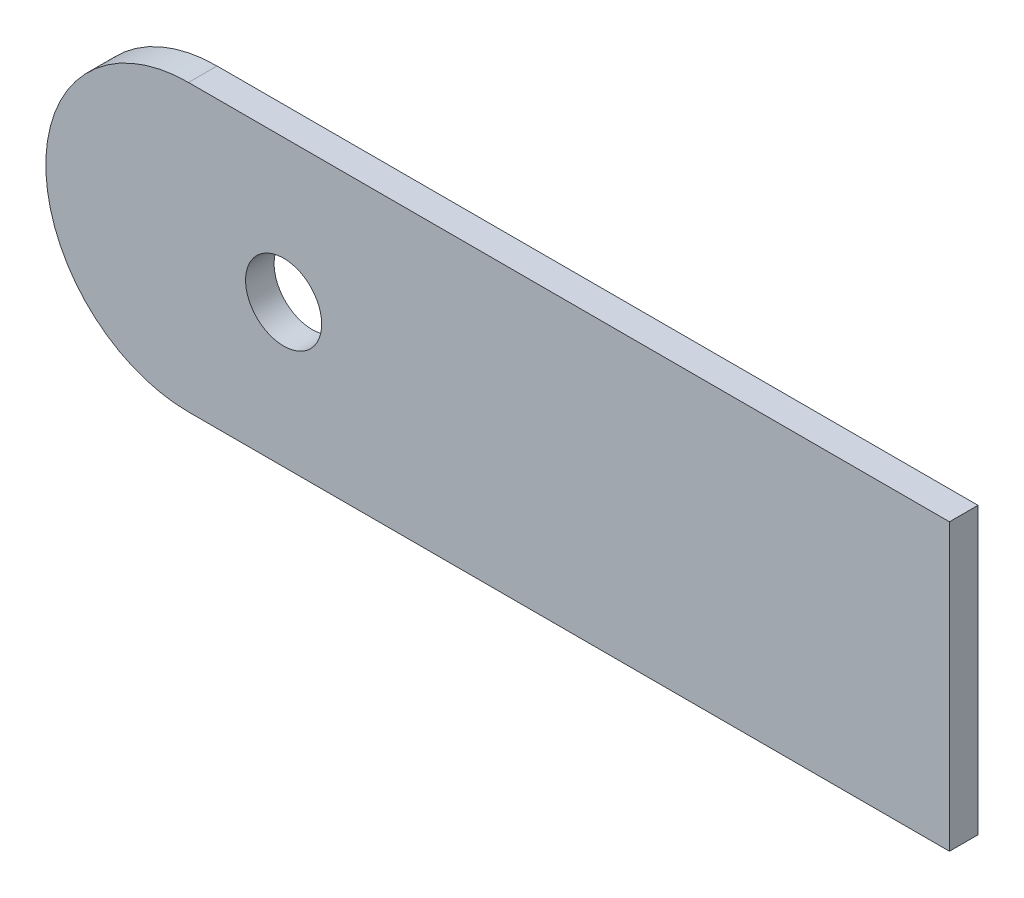
ISO-10303-21;
HEADER;
FILE_DESCRIPTION(('STEP AP214'),'2;1');
FILE_NAME('part.step','',(''),(''),'','','');
FILE_SCHEMA(('AUTOMOTIVE_DESIGN { 1 0 10303 214 1 1 1 1 }'));
ENDSEC;
DATA;
#1=APPLICATION_CONTEXT('core data for automotive mechanical design processes');
#2=APPLICATION_PROTOCOL_DEFINITION('international standard','automotive_design',2000,#1);
#3=PRODUCT_CONTEXT('',#1,'mechanical');
#4=PRODUCT('Part','Part','',(#3));
#5=PRODUCT_RELATED_PRODUCT_CATEGORY('part','',(#4));
#6=PRODUCT_DEFINITION_FORMATION('','',#4);
#7=PRODUCT_DEFINITION_CONTEXT('part definition',#1,'design');
#8=PRODUCT_DEFINITION('design','',#6,#7);
#9=PRODUCT_DEFINITION_SHAPE('','',#8);
#10=(LENGTH_UNIT() NAMED_UNIT(*) SI_UNIT(.MILLI.,.METRE.));
#11=(NAMED_UNIT(*) PLANE_ANGLE_UNIT() SI_UNIT($,.RADIAN.));
#12=(NAMED_UNIT(*) SI_UNIT($,.STERADIAN.) SOLID_ANGLE_UNIT());
#13=UNCERTAINTY_MEASURE_WITH_UNIT(LENGTH_MEASURE(1.E-05),#10,'distance_accuracy_value','');
#14=(GEOMETRIC_REPRESENTATION_CONTEXT(3) GLOBAL_UNCERTAINTY_ASSIGNED_CONTEXT((#13)) GLOBAL_UNIT_ASSIGNED_CONTEXT((#10,
#11,#12)) REPRESENTATION_CONTEXT('',''));
#15=CARTESIAN_POINT('',(0.,0.,0.));
#16=DIRECTION('',(0.,0.,1.));
#17=DIRECTION('',(1.,0.,0.));
#18=AXIS2_PLACEMENT_3D('',#15,#16,#17);
#19=CARTESIAN_POINT('',(-40.,0.,3.));
#20=DIRECTION('',(0.,0.,1.));
#21=DIRECTION('',(1.,0.,0.));
#22=AXIS2_PLACEMENT_3D('',#19,#20,#21);
#23=PLANE('',#22);
#24=DIRECTION('',(0.,1.,0.));
#25=VECTOR('',#24,1.);
#26=CARTESIAN_POINT('',(40.,15.,3.));
#27=LINE('',#26,#25);
#28=CARTESIAN_POINT('',(40.,-15.,3.));
#29=VERTEX_POINT('',#28);
#30=CARTESIAN_POINT('',(40.,15.,3.));
#31=VERTEX_POINT('',#30);
#32=EDGE_CURVE('E91',#29,#31,#27,.T.);
#33=ORIENTED_EDGE('',*,*,#32,.T.);
#34=DIRECTION('',(-1.,0.,0.));
#35=VECTOR('',#34,1.);
#36=CARTESIAN_POINT('',(-40.,15.,3.));
#37=LINE('',#36,#35);
#38=CARTESIAN_POINT('',(-40.,15.,3.));
#39=VERTEX_POINT('',#38);
#40=EDGE_CURVE('E86',#31,#39,#37,.T.);
#41=ORIENTED_EDGE('',*,*,#40,.T.);
#42=CARTESIAN_POINT('',(-40.,0.,3.));
#43=DIRECTION('',(0.,0.,1.));
#44=DIRECTION('',(1.,0.,0.));
#45=AXIS2_PLACEMENT_3D('',#42,#43,#44);
#46=CIRCLE('',#45,15.);
#47=CARTESIAN_POINT('',(-40.,-15.,3.));
#48=VERTEX_POINT('',#47);
#49=EDGE_CURVE('E89',#39,#48,#46,.T.);
#50=ORIENTED_EDGE('',*,*,#49,.T.);
#51=DIRECTION('',(1.,0.,0.));
#52=VECTOR('',#51,1.);
#53=CARTESIAN_POINT('',(-40.,-15.,3.));
#54=LINE('',#53,#52);
#55=EDGE_CURVE('E56',#48,#29,#54,.T.);
#56=ORIENTED_EDGE('',*,*,#55,.T.);
#57=EDGE_LOOP('',(#33,#41,#50,#56));
#58=FACE_BOUND('',#57,.T.);
#59=CARTESIAN_POINT('',(-30.,0.,3.));
#60=DIRECTION('',(0.,0.,1.));
#61=DIRECTION('',(1.,0.,0.));
#62=AXIS2_PLACEMENT_3D('',#59,#60,#61);
#63=CIRCLE('',#62,4.);
#64=CARTESIAN_POINT('',(-26.,0.,3.));
#65=VERTEX_POINT('',#64);
#66=EDGE_CURVE('E112',#65,#65,#63,.T.);
#67=ORIENTED_EDGE('',*,*,#66,.F.);
#68=EDGE_LOOP('',(#67));
#69=FACE_BOUND('',#68,.T.);
#70=ADVANCED_FACE('F38',(#58,#69),#23,.T.);
#71=CARTESIAN_POINT('',(-40.,0.,0.));
#72=DIRECTION('',(0.,0.,1.));
#73=DIRECTION('',(1.,0.,0.));
#74=AXIS2_PLACEMENT_3D('',#71,#72,#73);
#75=PLANE('',#74);
#76=DIRECTION('',(0.,1.,0.));
#77=VECTOR('',#76,1.);
#78=CARTESIAN_POINT('',(40.,15.,0.));
#79=LINE('',#78,#77);
#80=CARTESIAN_POINT('',(40.,-15.,0.));
#81=VERTEX_POINT('',#80);
#82=CARTESIAN_POINT('',(40.,15.,0.));
#83=VERTEX_POINT('',#82);
#84=EDGE_CURVE('E108',#81,#83,#79,.T.);
#85=ORIENTED_EDGE('',*,*,#84,.F.);
#86=DIRECTION('',(1.,0.,0.));
#87=VECTOR('',#86,1.);
#88=CARTESIAN_POINT('',(-40.,-15.,0.));
#89=LINE('',#88,#87);
#90=CARTESIAN_POINT('',(-40.,-15.,0.));
#91=VERTEX_POINT('',#90);
#92=EDGE_CURVE('E79',#91,#81,#89,.T.);
#93=ORIENTED_EDGE('',*,*,#92,.F.);
#94=CARTESIAN_POINT('',(-40.,0.,0.));
#95=DIRECTION('',(0.,0.,1.));
#96=DIRECTION('',(1.,0.,0.));
#97=AXIS2_PLACEMENT_3D('',#94,#95,#96);
#98=CIRCLE('',#97,15.);
#99=CARTESIAN_POINT('',(-40.,15.,0.));
#100=VERTEX_POINT('',#99);
#101=EDGE_CURVE('E73',#100,#91,#98,.T.);
#102=ORIENTED_EDGE('',*,*,#101,.F.);
#103=DIRECTION('',(-1.,0.,0.));
#104=VECTOR('',#103,1.);
#105=CARTESIAN_POINT('',(-40.,15.,0.));
#106=LINE('',#105,#104);
#107=EDGE_CURVE('E96',#83,#100,#106,.T.);
#108=ORIENTED_EDGE('',*,*,#107,.F.);
#109=EDGE_LOOP('',(#85,#93,#102,#108));
#110=FACE_BOUND('',#109,.T.);
#111=CARTESIAN_POINT('',(-30.,0.,0.));
#112=DIRECTION('',(0.,0.,1.));
#113=DIRECTION('',(1.,0.,0.));
#114=AXIS2_PLACEMENT_3D('',#111,#112,#113);
#115=CIRCLE('',#114,4.);
#116=CARTESIAN_POINT('',(-26.,0.,0.));
#117=VERTEX_POINT('',#116);
#118=EDGE_CURVE('E132',#117,#117,#115,.T.);
#119=ORIENTED_EDGE('',*,*,#118,.T.);
#120=EDGE_LOOP('',(#119));
#121=FACE_BOUND('',#120,.T.);
#122=ADVANCED_FACE('F126',(#110,#121),#75,.F.);
#123=CARTESIAN_POINT('',(40.,15.,3.));
#124=DIRECTION('',(-1.,0.,0.));
#125=DIRECTION('',(0.,0.,1.));
#126=AXIS2_PLACEMENT_3D('',#123,#124,#125);
#127=PLANE('',#126);
#128=ORIENTED_EDGE('',*,*,#84,.T.);
#129=DIRECTION('',(0.,0.,-1.));
#130=VECTOR('',#129,1.);
#131=CARTESIAN_POINT('',(40.,15.,3.));
#132=LINE('',#131,#130);
#133=EDGE_CURVE('E11',#31,#83,#132,.T.);
#134=ORIENTED_EDGE('',*,*,#133,.F.);
#135=ORIENTED_EDGE('',*,*,#32,.F.);
#136=DIRECTION('',(0.,0.,-1.));
#137=VECTOR('',#136,1.);
#138=CARTESIAN_POINT('',(40.,-15.,3.));
#139=LINE('',#138,#137);
#140=EDGE_CURVE('E104',#29,#81,#139,.T.);
#141=ORIENTED_EDGE('',*,*,#140,.T.);
#142=EDGE_LOOP('',(#128,#134,#135,#141));
#143=FACE_BOUND('',#142,.T.);
#144=ADVANCED_FACE('F40',(#143),#127,.F.);
#145=CARTESIAN_POINT('',(-40.,15.,3.));
#146=DIRECTION('',(0.,-1.,0.));
#147=DIRECTION('',(0.,0.,-1.));
#148=AXIS2_PLACEMENT_3D('',#145,#146,#147);
#149=PLANE('',#148);
#150=ORIENTED_EDGE('',*,*,#107,.T.);
#151=DIRECTION('',(0.,0.,-1.));
#152=VECTOR('',#151,1.);
#153=CARTESIAN_POINT('',(-40.,15.,3.));
#154=LINE('',#153,#152);
#155=EDGE_CURVE('E48',#39,#100,#154,.T.);
#156=ORIENTED_EDGE('',*,*,#155,.F.);
#157=ORIENTED_EDGE('',*,*,#40,.F.);
#158=ORIENTED_EDGE('',*,*,#133,.T.);
#159=EDGE_LOOP('',(#150,#156,#157,#158));
#160=FACE_BOUND('',#159,.T.);
#161=ADVANCED_FACE('F95',(#160),#149,.F.);
#162=CARTESIAN_POINT('',(-40.,0.,3.));
#163=DIRECTION('',(0.,0.,-1.));
#164=DIRECTION('',(-1.,0.,0.));
#165=AXIS2_PLACEMENT_3D('',#162,#163,#164);
#166=CYLINDRICAL_SURFACE('',#165,15.);
#167=ORIENTED_EDGE('',*,*,#101,.T.);
#168=DIRECTION('',(0.,0.,-1.));
#169=VECTOR('',#168,1.);
#170=CARTESIAN_POINT('',(-40.,-15.,3.));
#171=LINE('',#170,#169);
#172=EDGE_CURVE('E98',#48,#91,#171,.T.);
#173=ORIENTED_EDGE('',*,*,#172,.F.);
#174=ORIENTED_EDGE('',*,*,#49,.F.);
#175=ORIENTED_EDGE('',*,*,#155,.T.);
#176=EDGE_LOOP('',(#167,#173,#174,#175));
#177=FACE_BOUND('',#176,.T.);
#178=ADVANCED_FACE('F99',(#177),#166,.T.);
#179=CARTESIAN_POINT('',(-40.,-15.,3.));
#180=DIRECTION('',(0.,1.,0.));
#181=DIRECTION('',(0.,0.,1.));
#182=AXIS2_PLACEMENT_3D('',#179,#180,#181);
#183=PLANE('',#182);
#184=ORIENTED_EDGE('',*,*,#92,.T.);
#185=ORIENTED_EDGE('',*,*,#140,.F.);
#186=ORIENTED_EDGE('',*,*,#55,.F.);
#187=ORIENTED_EDGE('',*,*,#172,.T.);
#188=EDGE_LOOP('',(#184,#185,#186,#187));
#189=FACE_BOUND('',#188,.T.);
#190=ADVANCED_FACE('F123',(#189),#183,.F.);
#191=CARTESIAN_POINT('',(-30.,0.,3.));
#192=DIRECTION('',(0.,0.,-1.));
#193=DIRECTION('',(-1.,0.,0.));
#194=AXIS2_PLACEMENT_3D('',#191,#192,#193);
#195=CYLINDRICAL_SURFACE('',#194,4.);
#196=ORIENTED_EDGE('',*,*,#66,.T.);
#197=EDGE_LOOP('',(#196));
#198=FACE_BOUND('',#197,.T.);
#199=ORIENTED_EDGE('',*,*,#118,.F.);
#200=EDGE_LOOP('',(#199));
#201=FACE_BOUND('',#200,.T.);
#202=ADVANCED_FACE('F141',(#198,#201),#195,.F.);
#203=CLOSED_SHELL('',(#70,#122,#144,#161,#178,#190,#202));
#204=MANIFOLD_SOLID_BREP('B2',#203);
#205=ADVANCED_BREP_SHAPE_REPRESENTATION('',(#18,#204),#14);
#206=SHAPE_DEFINITION_REPRESENTATION(#9,#205);
ENDSEC;
END-ISO-10303-21;
